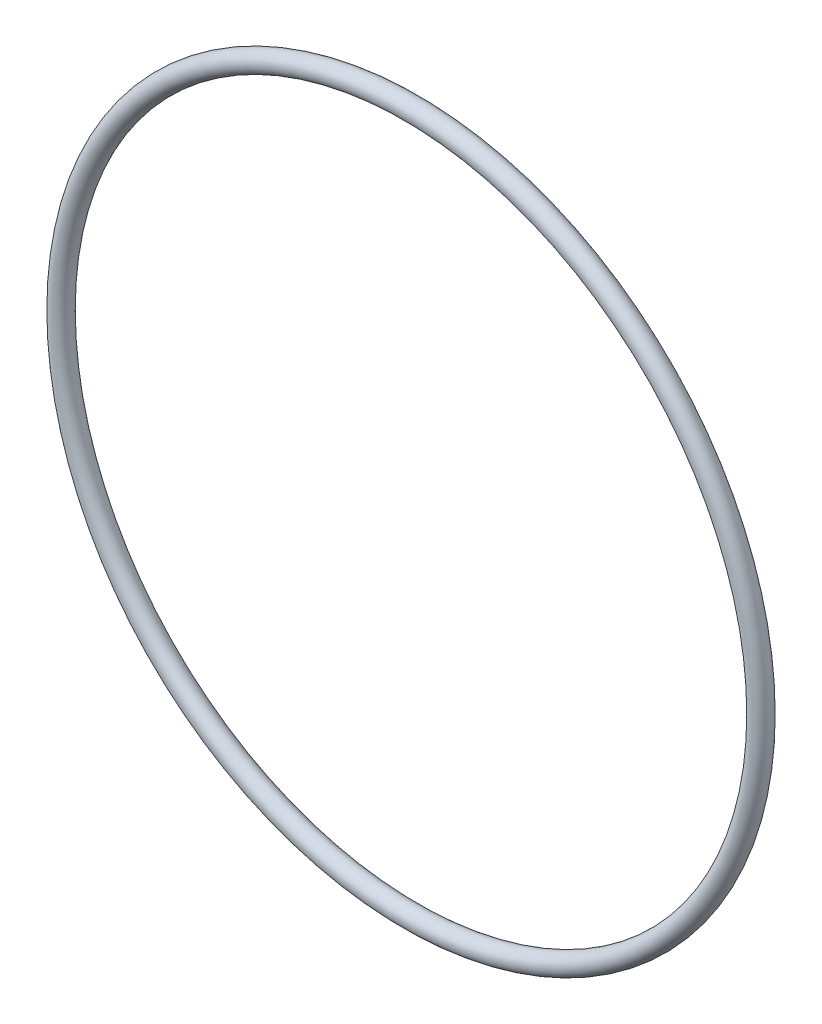
ISO-10303-21;
HEADER;
FILE_DESCRIPTION(('STEP AP214'),'2;1');
FILE_NAME('part.step','',(''),(''),'','','');
FILE_SCHEMA(('AUTOMOTIVE_DESIGN { 1 0 10303 214 1 1 1 1 }'));
ENDSEC;
DATA;
#1=APPLICATION_CONTEXT('core data for automotive mechanical design processes');
#2=APPLICATION_PROTOCOL_DEFINITION('international standard','automotive_design',2000,#1);
#3=PRODUCT_CONTEXT('',#1,'mechanical');
#4=PRODUCT('Part','Part','',(#3));
#5=PRODUCT_RELATED_PRODUCT_CATEGORY('part','',(#4));
#6=PRODUCT_DEFINITION_FORMATION('','',#4);
#7=PRODUCT_DEFINITION_CONTEXT('part definition',#1,'design');
#8=PRODUCT_DEFINITION('design','',#6,#7);
#9=PRODUCT_DEFINITION_SHAPE('','',#8);
#10=(LENGTH_UNIT() NAMED_UNIT(*) SI_UNIT(.MILLI.,.METRE.));
#11=(NAMED_UNIT(*) PLANE_ANGLE_UNIT() SI_UNIT($,.RADIAN.));
#12=(NAMED_UNIT(*) SI_UNIT($,.STERADIAN.) SOLID_ANGLE_UNIT());
#13=UNCERTAINTY_MEASURE_WITH_UNIT(LENGTH_MEASURE(1.E-05),#10,'distance_accuracy_value','');
#14=(GEOMETRIC_REPRESENTATION_CONTEXT(3) GLOBAL_UNCERTAINTY_ASSIGNED_CONTEXT((#13)) GLOBAL_UNIT_ASSIGNED_CONTEXT((#10,
#11,#12)) REPRESENTATION_CONTEXT('',''));
#15=CARTESIAN_POINT('',(0.,0.,0.));
#16=DIRECTION('',(0.,0.,1.));
#17=DIRECTION('',(1.,0.,0.));
#18=AXIS2_PLACEMENT_3D('',#15,#16,#17);
#19=CARTESIAN_POINT('',(0.,0.,0.));
#20=DIRECTION('',(0.,0.,1.));
#21=DIRECTION('',(1.,0.,0.));
#22=AXIS2_PLACEMENT_3D('',#19,#20,#21);
#23=TOROIDAL_SURFACE('',#22,55.245,1.5875);
#24=CARTESIAN_POINT('',(55.245,0.,0.));
#25=DIRECTION('',(0.,1.,0.));
#26=DIRECTION('',(-1.,0.,0.));
#27=AXIS2_PLACEMENT_3D('',#24,#25,#26);
#28=CIRCLE('',#27,1.5875);
#29=CARTESIAN_POINT('',(56.8325,0.,0.));
#30=VERTEX_POINT('',#29);
#31=EDGE_CURVE('E11',#30,#30,#28,.T.);
#32=CARTESIAN_POINT('',(0.,0.,0.));
#33=DIRECTION('',(0.,0.,1.));
#34=DIRECTION('',(1.,0.,0.));
#35=AXIS2_PLACEMENT_3D('',#32,#33,#34);
#36=CIRCLE('',#35,56.8325);
#37=EDGE_CURVE('',#30,#30,#36,.T.);
#38=ORIENTED_EDGE('',*,*,#31,.T.);
#39=ORIENTED_EDGE('',*,*,#31,.F.);
#40=ORIENTED_EDGE('',*,*,#37,.T.);
#41=ORIENTED_EDGE('',*,*,#37,.F.);
#42=EDGE_LOOP('',(#38,#40,#39,#41));
#43=FACE_BOUND('',#42,.T.);
#44=ADVANCED_FACE('F44',(#43),#23,.T.);
#45=CLOSED_SHELL('',(#44));
#46=MANIFOLD_SOLID_BREP('B2',#45);
#47=ADVANCED_BREP_SHAPE_REPRESENTATION('',(#18,#46),#14);
#48=SHAPE_DEFINITION_REPRESENTATION(#9,#47);
ENDSEC;
END-ISO-10303-21;
